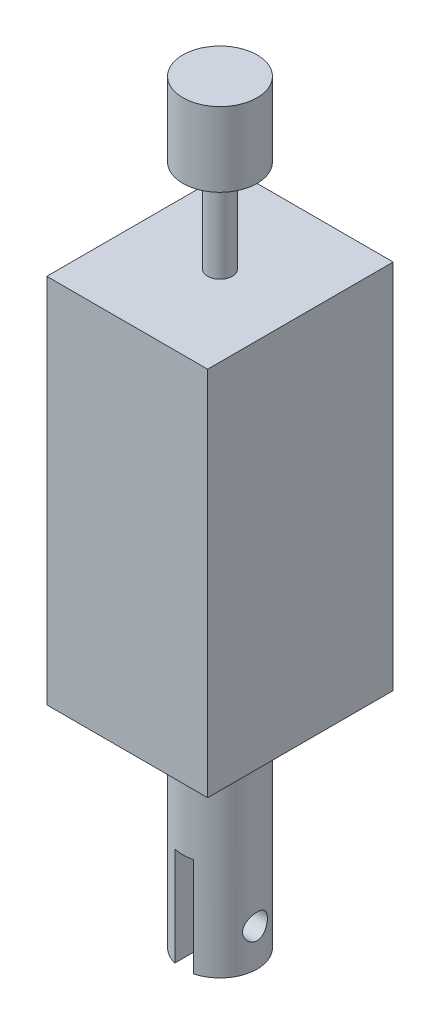
ISO-10303-21;
HEADER;
FILE_DESCRIPTION(('STEP AP214'),'2;1');
FILE_NAME('part.step','',(''),(''),'','','');
FILE_SCHEMA(('AUTOMOTIVE_DESIGN { 1 0 10303 214 1 1 1 1 }'));
ENDSEC;
DATA;
#1=APPLICATION_CONTEXT('core data for automotive mechanical design processes');
#2=APPLICATION_PROTOCOL_DEFINITION('international standard','automotive_design',2000,#1);
#3=PRODUCT_CONTEXT('',#1,'mechanical');
#4=PRODUCT('Part','Part','',(#3));
#5=PRODUCT_RELATED_PRODUCT_CATEGORY('part','',(#4));
#6=PRODUCT_DEFINITION_FORMATION('','',#4);
#7=PRODUCT_DEFINITION_CONTEXT('part definition',#1,'design');
#8=PRODUCT_DEFINITION('design','',#6,#7);
#9=PRODUCT_DEFINITION_SHAPE('','',#8);
#10=(LENGTH_UNIT() NAMED_UNIT(*) SI_UNIT(.MILLI.,.METRE.));
#11=(NAMED_UNIT(*) PLANE_ANGLE_UNIT() SI_UNIT($,.RADIAN.));
#12=(NAMED_UNIT(*) SI_UNIT($,.STERADIAN.) SOLID_ANGLE_UNIT());
#13=UNCERTAINTY_MEASURE_WITH_UNIT(LENGTH_MEASURE(1.E-05),#10,'distance_accuracy_value','');
#14=(GEOMETRIC_REPRESENTATION_CONTEXT(3) GLOBAL_UNCERTAINTY_ASSIGNED_CONTEXT((#13)) GLOBAL_UNIT_ASSIGNED_CONTEXT((#10,
#11,#12)) REPRESENTATION_CONTEXT('',''));
#15=CARTESIAN_POINT('',(0.,0.,0.));
#16=DIRECTION('',(0.,0.,1.));
#17=DIRECTION('',(1.,0.,0.));
#18=AXIS2_PLACEMENT_3D('',#15,#16,#17);
#19=CARTESIAN_POINT('',(0.,-32.5,7.5));
#20=DIRECTION('',(0.,-1.,0.));
#21=DIRECTION('',(0.,0.,-1.));
#22=AXIS2_PLACEMENT_3D('',#19,#20,#21);
#23=PLANE('',#22);
#24=DIRECTION('',(0.,0.,-1.));
#25=VECTOR('',#24,1.);
#26=CARTESIAN_POINT('',(0.75,-32.5,15.));
#27=LINE('',#26,#25);
#28=CARTESIAN_POINT('',(0.75,-32.5,10.4047375096556));
#29=VERTEX_POINT('',#28);
#30=CARTESIAN_POINT('',(0.75,-32.5,4.59526249034444));
#31=VERTEX_POINT('',#30);
#32=EDGE_CURVE('E240',#29,#31,#27,.T.);
#33=ORIENTED_EDGE('',*,*,#32,.T.);
#34=CARTESIAN_POINT('',(0.,-32.5,7.5));
#35=DIRECTION('',(0.,-1.,0.));
#36=DIRECTION('',(0.,0.,-1.));
#37=AXIS2_PLACEMENT_3D('',#34,#35,#36);
#38=CIRCLE('',#37,3.);
#39=EDGE_CURVE('E136',#31,#29,#38,.T.);
#40=ORIENTED_EDGE('',*,*,#39,.T.);
#41=EDGE_LOOP('',(#33,#40));
#42=FACE_BOUND('',#41,.T.);
#43=ADVANCED_FACE('F39',(#42),#23,.T.);
#44=CARTESIAN_POINT('',(-6.5,-29.5,7.5));
#45=DIRECTION('',(1.,0.,0.));
#46=DIRECTION('',(0.,0.,-1.));
#47=AXIS2_PLACEMENT_3D('',#44,#45,#46);
#48=CYLINDRICAL_SURFACE('',#47,1.);
#49=CARTESIAN_POINT('',(0.750000000000001,-29.5,7.5));
#50=DIRECTION('',(1.,0.,0.));
#51=DIRECTION('',(0.,0.,-1.));
#52=AXIS2_PLACEMENT_3D('',#49,#50,#51);
#53=CIRCLE('',#52,1.);
#54=CARTESIAN_POINT('',(0.750000000000001,-29.5,6.5));
#55=VERTEX_POINT('',#54);
#56=EDGE_CURVE('E250',#55,#55,#53,.F.);
#57=ORIENTED_EDGE('',*,*,#56,.T.);
#58=EDGE_LOOP('',(#57));
#59=FACE_BOUND('',#58,.T.);
#60=CARTESIAN_POINT('',(2.82842712474619,-29.5,6.5));
#61=CARTESIAN_POINT('',(2.82842694532735,-29.5544681748107,6.4999997420522));
#62=CARTESIAN_POINT('',(2.83001769372806,-29.6089347997715,6.50446521630186));
#63=CARTESIAN_POINT('',(2.8361757417458,-29.7162544209506,6.52214886829744));
#64=CARTESIAN_POINT('',(2.8407435316722,-29.7691071498639,6.53536848782933));
#65=CARTESIAN_POINT('',(2.85228203663888,-29.8716268930128,6.57004451431974));
#66=CARTESIAN_POINT('',(2.8592480396464,-29.9212999294469,6.591484778598));
#67=CARTESIAN_POINT('',(2.87479122017008,-30.0163600485438,6.64193837155737));
#68=CARTESIAN_POINT('',(2.88336875305432,-30.0617461825525,6.67095337113948));
#69=CARTESIAN_POINT('',(2.90154489405589,-30.1487199623395,6.73694885355748));
#70=CARTESIAN_POINT('',(2.91116894844139,-30.190115428672,6.77417565862218));
#71=CARTESIAN_POINT('',(2.93013864801509,-30.2662068012243,6.85501233278551));
#72=CARTESIAN_POINT('',(2.93948424829099,-30.3009016315823,6.8986232249476));
#73=CARTESIAN_POINT('',(2.95713866921658,-30.3634788973297,6.99239549203502));
#74=CARTESIAN_POINT('',(2.96541407701568,-30.391159970618,7.04269808877548));
#75=CARTESIAN_POINT('',(2.97969586771021,-30.4375915851275,7.14756877701252));
#76=CARTESIAN_POINT('',(2.98570286203012,-30.4563445331769,7.20213571431279));
#77=CARTESIAN_POINT('',(2.99459075431897,-30.4837358546324,7.31197118256651));
#78=CARTESIAN_POINT('',(2.99757314777558,-30.492703446257,7.36714924514704));
#79=CARTESIAN_POINT('',(3.00043608218249,-30.5013162933607,7.47830212517591));
#80=CARTESIAN_POINT('',(3.00031742262891,-30.5009639516524,7.53427673354389));
#81=CARTESIAN_POINT('',(2.99706039618736,-30.491155745434,7.64310351519382));
#82=CARTESIAN_POINT('',(2.99404064755135,-30.4820574715255,7.69599204859167));
#83=CARTESIAN_POINT('',(2.98546967339714,-30.4556070190195,7.79944343882216));
#84=CARTESIAN_POINT('',(2.97991827631115,-30.4382542810202,7.85000613777918));
#85=CARTESIAN_POINT('',(2.96675670293292,-30.3955786826939,7.94815247484201));
#86=CARTESIAN_POINT('',(2.9591204252427,-30.3701540614532,7.995688220969));
#87=CARTESIAN_POINT('',(2.94258393038665,-30.3121402945516,8.08592432552717));
#88=CARTESIAN_POINT('',(2.93368336200518,-30.2795491566734,8.12862333438477));
#89=CARTESIAN_POINT('',(2.9150619185089,-30.2063256065393,8.21010086655191));
#90=CARTESIAN_POINT('',(2.90532215172667,-30.1653868421546,8.24860015706755));
#91=CARTESIAN_POINT('',(2.88647335245111,-30.0775512742773,8.31827725959589));
#92=CARTESIAN_POINT('',(2.8773644173145,-30.0306535542868,8.34945394327301));
#93=CARTESIAN_POINT('',(2.86070525135531,-29.9313463743846,8.40398745504273));
#94=CARTESIAN_POINT('',(2.85317909338821,-29.8788678686322,8.42722646365105));
#95=CARTESIAN_POINT('',(2.84081650878299,-29.7704286057337,8.46444319329951));
#96=CARTESIAN_POINT('',(2.83597895501223,-29.7144693187782,8.47842479575553));
#97=CARTESIAN_POINT('',(2.8297963630207,-29.6033616445994,8.49616128209047));
#98=CARTESIAN_POINT('',(2.82830360315139,-29.5482905752543,8.50034909550575));
#99=CARTESIAN_POINT('',(2.828566720628,-29.438223850883,8.4996054389116));
#100=CARTESIAN_POINT('',(2.83032200792768,-29.3832281839752,8.49467562522726));
#101=CARTESIAN_POINT('',(2.83673618089379,-29.2768430342888,8.47622565155183));
#102=CARTESIAN_POINT('',(2.84129325440593,-29.2253945698494,8.46300639398055));
#103=CARTESIAN_POINT('',(2.8526855367127,-29.1254563937606,8.4287138625606));
#104=CARTESIAN_POINT('',(2.85952114934907,-29.0769672084092,8.40763919636346));
#105=CARTESIAN_POINT('',(2.87496877595718,-28.9826195791531,8.3574743407389));
#106=CARTESIAN_POINT('',(2.8836302566561,-28.9368933573582,8.32815111835849));
#107=CARTESIAN_POINT('',(2.90165768730984,-28.8508539476163,8.26258563055756));
#108=CARTESIAN_POINT('',(2.911023844438,-28.8105423613388,8.22634132549878));
#109=CARTESIAN_POINT('',(2.92995038637844,-28.7344720159094,8.14589170590032));
#110=CARTESIAN_POINT('',(2.93949843577895,-28.6990256099812,8.10138727054665));
#111=CARTESIAN_POINT('',(2.9572685161311,-28.636083857652,8.00682729140026));
#112=CARTESIAN_POINT('',(2.96549059417695,-28.6085882288376,7.95677194486455));
#113=CARTESIAN_POINT('',(2.97964405810603,-28.5625798951383,7.85277986243229));
#114=CARTESIAN_POINT('',(2.98559030004531,-28.5440087228519,7.7988711233212));
#115=CARTESIAN_POINT('',(2.99458610837774,-28.5162722579399,7.68845846584602));
#116=CARTESIAN_POINT('',(2.99763672034018,-28.5071035701195,7.63195549195389));
#117=CARTESIAN_POINT('',(3.00041863236257,-28.4987379223944,7.52081533586004));
#118=CARTESIAN_POINT('',(3.00029920089441,-28.4990925460676,7.46621527607998));
#119=CARTESIAN_POINT('',(2.99712196519396,-28.5086573081464,7.35788885499983));
#120=CARTESIAN_POINT('',(2.99406439933567,-28.5178667281528,7.30416242318094));
#121=CARTESIAN_POINT('',(2.98540914954421,-28.544582234576,7.19995788056794));
#122=CARTESIAN_POINT('',(2.9798525836118,-28.561954215353,7.1494417290872));
#123=CARTESIAN_POINT('',(2.96677160704464,-28.6043775310971,7.05202164906021));
#124=CARTESIAN_POINT('',(2.95924684047901,-28.6294302551969,7.00511837585759));
#125=CARTESIAN_POINT('',(2.94265868828001,-28.6875695121021,6.91436598369119));
#126=CARTESIAN_POINT('',(2.93354872492381,-28.7209186853819,6.8706937484423));
#127=CARTESIAN_POINT('',(2.91492988791425,-28.7942573911559,6.78941897372766));
#128=CARTESIAN_POINT('',(2.90542088771397,-28.8342490422617,6.75181837837574));
#129=CARTESIAN_POINT('',(2.88663279827365,-28.921609355588,6.68225819116654));
#130=CARTESIAN_POINT('',(2.87737727995345,-28.9692055109808,6.65057703400078));
#131=CARTESIAN_POINT('',(2.86060193316303,-29.0693344268987,6.5956856567002));
#132=CARTESIAN_POINT('',(2.8530816513617,-29.1218658930142,6.57247322318544));
#133=CARTESIAN_POINT('',(2.84101334230535,-29.2279618240238,6.53615617179337));
#134=CARTESIAN_POINT('',(2.83634632944799,-29.2813722635657,6.52264209083673));
#135=CARTESIAN_POINT('',(2.83005383613939,-29.3898560505155,6.50456567983831));
#136=CARTESIAN_POINT('',(2.82842730615135,-29.4449288174357,6.5000002608035));
#137=CARTESIAN_POINT('',(2.82842712474619,-29.5,6.5));
#138=B_SPLINE_CURVE_WITH_KNOTS('',3,(#60,#61,#62,#63,#64,#65,#66,#67,#68,#69,#70,#71,#72,#73,
#74,#75,#76,#77,#78,#79,#80,#81,#82,#83,#84,#85,#86,#87,#88,#89,#90,#91,#92,#93,#94,#95,#96,#97,
#98,#99,#100,#101,#102,#103,#104,#105,#106,#107,#108,#109,#110,#111,#112,#113,#114,#115,#116,
#117,#118,#119,#120,#121,#122,#123,#124,#125,#126,#127,#128,#129,#130,#131,#132,#133,#134,#135,
#136,#137),.UNSPECIFIED.,.T.,.F.,(4,2,2,2,2,2,2,2,2,2,2,2,2,2,2,2,2,2,2,2,2,2,2,2,2,2,2,2,2,2,2,
2,2,2,2,2,2,2,4),(0.,0.163200584775416,0.326428054968882,0.489336627454547,0.652281166139164,
0.821013374229402,0.989772651673597,1.16293506139029,1.33605076382161,1.50314318760306,
1.67019253297699,1.83069004820941,1.99119844184608,2.15381654855707,2.31647991869394,
2.48680174359289,2.65714979607478,2.82992639837376,3.00263051349689,3.16754291357513,
3.33242535830307,3.49164395761849,3.65089079140019,3.81518857728788,3.979534856552,
4.15178808164166,4.32403518750605,4.49513791183924,4.66617882997229,4.82918084670708,
4.99216964002854,5.15256956033503,5.31299850756315,5.47935519513706,5.64576504425705,
5.81868902729218,5.99156778259939,6.15663212153686,6.32163947179229),.UNSPECIFIED.);
#139=CARTESIAN_POINT('',(2.82842712474619,-29.5,6.5));
#140=VERTEX_POINT('',#139);
#141=EDGE_CURVE('E153',#140,#140,#138,.T.);
#142=ORIENTED_EDGE('',*,*,#141,.F.);
#143=EDGE_LOOP('',(#142));
#144=FACE_BOUND('',#143,.T.);
#145=ADVANCED_FACE('F224',(#59,#144),#48,.F.);
#146=CARTESIAN_POINT('',(6.5,-15.,15.));
#147=DIRECTION('',(-1.,0.,0.));
#148=DIRECTION('',(0.,0.,1.));
#149=AXIS2_PLACEMENT_3D('',#146,#147,#148);
#150=PLANE('',#149);
#151=DIRECTION('',(0.,1.,0.));
#152=VECTOR('',#151,1.);
#153=CARTESIAN_POINT('',(6.5,-15.,0.));
#154=LINE('',#153,#152);
#155=CARTESIAN_POINT('',(6.5,-15.,0.));
#156=VERTEX_POINT('',#155);
#157=CARTESIAN_POINT('',(6.5,15.,0.));
#158=VERTEX_POINT('',#157);
#159=EDGE_CURVE('E166',#156,#158,#154,.T.);
#160=ORIENTED_EDGE('',*,*,#159,.T.);
#161=DIRECTION('',(0.,0.,-1.));
#162=VECTOR('',#161,1.);
#163=CARTESIAN_POINT('',(6.5,15.,15.));
#164=LINE('',#163,#162);
#165=CARTESIAN_POINT('',(6.5,15.,15.));
#166=VERTEX_POINT('',#165);
#167=EDGE_CURVE('E198',#166,#158,#164,.T.);
#168=ORIENTED_EDGE('',*,*,#167,.F.);
#169=DIRECTION('',(0.,1.,0.));
#170=VECTOR('',#169,1.);
#171=CARTESIAN_POINT('',(6.5,-15.,15.));
#172=LINE('',#171,#170);
#173=CARTESIAN_POINT('',(6.5,-15.,15.));
#174=VERTEX_POINT('',#173);
#175=EDGE_CURVE('E167',#174,#166,#172,.T.);
#176=ORIENTED_EDGE('',*,*,#175,.F.);
#177=DIRECTION('',(0.,0.,-1.));
#178=VECTOR('',#177,1.);
#179=CARTESIAN_POINT('',(6.5,-15.,15.));
#180=LINE('',#179,#178);
#181=EDGE_CURVE('E177',#174,#156,#180,.T.);
#182=ORIENTED_EDGE('',*,*,#181,.T.);
#183=EDGE_LOOP('',(#160,#168,#176,#182));
#184=FACE_BOUND('',#183,.T.);
#185=ADVANCED_FACE('F41',(#184),#150,.F.);
#186=CARTESIAN_POINT('',(-6.5,15.,15.));
#187=DIRECTION('',(0.,-1.,0.));
#188=DIRECTION('',(0.,0.,-1.));
#189=AXIS2_PLACEMENT_3D('',#186,#187,#188);
#190=PLANE('',#189);
#191=CARTESIAN_POINT('',(0.,15.,7.5));
#192=DIRECTION('',(0.,-1.,0.));
#193=DIRECTION('',(0.,0.,-1.));
#194=AXIS2_PLACEMENT_3D('',#191,#192,#193);
#195=CIRCLE('',#194,1.);
#196=CARTESIAN_POINT('',(0.,15.,6.5));
#197=VERTEX_POINT('',#196);
#198=EDGE_CURVE('E154',#197,#197,#195,.F.);
#199=ORIENTED_EDGE('',*,*,#198,.F.);
#200=EDGE_LOOP('',(#199));
#201=FACE_BOUND('',#200,.T.);
#202=DIRECTION('',(-1.,0.,0.));
#203=VECTOR('',#202,1.);
#204=CARTESIAN_POINT('',(-6.5,15.,0.));
#205=LINE('',#204,#203);
#206=CARTESIAN_POINT('',(-6.5,15.,0.));
#207=VERTEX_POINT('',#206);
#208=EDGE_CURVE('E181',#158,#207,#205,.T.);
#209=ORIENTED_EDGE('',*,*,#208,.T.);
#210=DIRECTION('',(0.,0.,-1.));
#211=VECTOR('',#210,1.);
#212=CARTESIAN_POINT('',(-6.5,15.,15.));
#213=LINE('',#212,#211);
#214=CARTESIAN_POINT('',(-6.5,15.,15.));
#215=VERTEX_POINT('',#214);
#216=EDGE_CURVE('E194',#215,#207,#213,.T.);
#217=ORIENTED_EDGE('',*,*,#216,.F.);
#218=DIRECTION('',(-1.,0.,0.));
#219=VECTOR('',#218,1.);
#220=CARTESIAN_POINT('',(-6.5,15.,15.));
#221=LINE('',#220,#219);
#222=EDGE_CURVE('E93',#166,#215,#221,.T.);
#223=ORIENTED_EDGE('',*,*,#222,.F.);
#224=ORIENTED_EDGE('',*,*,#167,.T.);
#225=EDGE_LOOP('',(#209,#217,#223,#224));
#226=FACE_BOUND('',#225,.T.);
#227=ADVANCED_FACE('F381',(#201,#226),#190,.F.);
#228=CARTESIAN_POINT('',(-6.5,-15.,15.));
#229=DIRECTION('',(1.,0.,0.));
#230=DIRECTION('',(0.,0.,-1.));
#231=AXIS2_PLACEMENT_3D('',#228,#229,#230);
#232=PLANE('',#231);
#233=DIRECTION('',(0.,-1.,0.));
#234=VECTOR('',#233,1.);
#235=CARTESIAN_POINT('',(-6.5,-15.,0.));
#236=LINE('',#235,#234);
#237=CARTESIAN_POINT('',(-6.5,-15.,0.));
#238=VERTEX_POINT('',#237);
#239=EDGE_CURVE('E184',#207,#238,#236,.T.);
#240=ORIENTED_EDGE('',*,*,#239,.T.);
#241=DIRECTION('',(0.,0.,-1.));
#242=VECTOR('',#241,1.);
#243=CARTESIAN_POINT('',(-6.5,-15.,15.));
#244=LINE('',#243,#242);
#245=CARTESIAN_POINT('',(-6.5,-15.,15.));
#246=VERTEX_POINT('',#245);
#247=EDGE_CURVE('E191',#246,#238,#244,.T.);
#248=ORIENTED_EDGE('',*,*,#247,.F.);
#249=DIRECTION('',(0.,-1.,0.));
#250=VECTOR('',#249,1.);
#251=CARTESIAN_POINT('',(-6.5,-15.,15.));
#252=LINE('',#251,#250);
#253=EDGE_CURVE('E172',#215,#246,#252,.T.);
#254=ORIENTED_EDGE('',*,*,#253,.F.);
#255=ORIENTED_EDGE('',*,*,#216,.T.);
#256=EDGE_LOOP('',(#240,#248,#254,#255));
#257=FACE_BOUND('',#256,.T.);
#258=ADVANCED_FACE('F332',(#257),#232,.F.);
#259=CARTESIAN_POINT('',(-6.5,-15.,15.));
#260=DIRECTION('',(0.,1.,0.));
#261=DIRECTION('',(0.,0.,1.));
#262=AXIS2_PLACEMENT_3D('',#259,#260,#261);
#263=PLANE('',#262);
#264=CARTESIAN_POINT('',(0.,-15.,7.5));
#265=DIRECTION('',(0.,-1.,0.));
#266=DIRECTION('',(0.,0.,-1.));
#267=AXIS2_PLACEMENT_3D('',#264,#265,#266);
#268=CIRCLE('',#267,3.);
#269=CARTESIAN_POINT('',(0.,-15.,4.5));
#270=VERTEX_POINT('',#269);
#271=EDGE_CURVE('E149',#270,#270,#268,.T.);
#272=ORIENTED_EDGE('',*,*,#271,.F.);
#273=EDGE_LOOP('',(#272));
#274=FACE_BOUND('',#273,.T.);
#275=DIRECTION('',(1.,0.,0.));
#276=VECTOR('',#275,1.);
#277=CARTESIAN_POINT('',(-6.5,-15.,0.));
#278=LINE('',#277,#276);
#279=EDGE_CURVE('E85',#238,#156,#278,.T.);
#280=ORIENTED_EDGE('',*,*,#279,.T.);
#281=ORIENTED_EDGE('',*,*,#181,.F.);
#282=DIRECTION('',(1.,0.,0.));
#283=VECTOR('',#282,1.);
#284=CARTESIAN_POINT('',(-6.5,-15.,15.));
#285=LINE('',#284,#283);
#286=EDGE_CURVE('E64',#246,#174,#285,.T.);
#287=ORIENTED_EDGE('',*,*,#286,.F.);
#288=ORIENTED_EDGE('',*,*,#247,.T.);
#289=EDGE_LOOP('',(#280,#281,#287,#288));
#290=FACE_BOUND('',#289,.T.);
#291=ADVANCED_FACE('F326',(#274,#290),#263,.F.);
#292=CARTESIAN_POINT('',(0.,0.,15.));
#293=DIRECTION('',(0.,0.,-1.));
#294=DIRECTION('',(-1.,0.,0.));
#295=AXIS2_PLACEMENT_3D('',#292,#293,#294);
#296=PLANE('',#295);
#297=ORIENTED_EDGE('',*,*,#175,.T.);
#298=ORIENTED_EDGE('',*,*,#222,.T.);
#299=ORIENTED_EDGE('',*,*,#253,.T.);
#300=ORIENTED_EDGE('',*,*,#286,.T.);
#301=EDGE_LOOP('',(#297,#298,#299,#300));
#302=FACE_BOUND('',#301,.T.);
#303=ADVANCED_FACE('F331',(#302),#296,.F.);
#304=CARTESIAN_POINT('',(0.,0.,0.));
#305=DIRECTION('',(0.,0.,-1.));
#306=DIRECTION('',(-1.,0.,0.));
#307=AXIS2_PLACEMENT_3D('',#304,#305,#306);
#308=PLANE('',#307);
#309=ORIENTED_EDGE('',*,*,#159,.F.);
#310=ORIENTED_EDGE('',*,*,#279,.F.);
#311=ORIENTED_EDGE('',*,*,#239,.F.);
#312=ORIENTED_EDGE('',*,*,#208,.F.);
#313=EDGE_LOOP('',(#309,#310,#311,#312));
#314=FACE_BOUND('',#313,.T.);
#315=ADVANCED_FACE('F373',(#314),#308,.T.);
#316=CARTESIAN_POINT('',(0.,22.5,7.5));
#317=DIRECTION('',(0.,-1.,0.));
#318=DIRECTION('',(0.,0.,-1.));
#319=AXIS2_PLACEMENT_3D('',#316,#317,#318);
#320=CYLINDRICAL_SURFACE('',#319,1.);
#321=CARTESIAN_POINT('',(0.,22.5,7.5));
#322=DIRECTION('',(0.,1.,0.));
#323=DIRECTION('',(0.,0.,1.));
#324=AXIS2_PLACEMENT_3D('',#321,#322,#323);
#325=CIRCLE('',#324,1.);
#326=CARTESIAN_POINT('',(0.,22.5,8.5));
#327=VERTEX_POINT('',#326);
#328=EDGE_CURVE('E159',#327,#327,#325,.T.);
#329=ORIENTED_EDGE('',*,*,#328,.F.);
#330=EDGE_LOOP('',(#329));
#331=FACE_BOUND('',#330,.T.);
#332=ORIENTED_EDGE('',*,*,#198,.T.);
#333=EDGE_LOOP('',(#332));
#334=FACE_BOUND('',#333,.T.);
#335=ADVANCED_FACE('F363',(#331,#334),#320,.T.);
#336=CARTESIAN_POINT('',(0.,28.5,7.5));
#337=DIRECTION('',(0.,-1.,0.));
#338=DIRECTION('',(0.,0.,-1.));
#339=AXIS2_PLACEMENT_3D('',#336,#337,#338);
#340=CYLINDRICAL_SURFACE('',#339,3.);
#341=CARTESIAN_POINT('',(0.,28.5,7.5));
#342=DIRECTION('',(0.,1.,0.));
#343=DIRECTION('',(0.,0.,1.));
#344=AXIS2_PLACEMENT_3D('',#341,#342,#343);
#345=CIRCLE('',#344,3.);
#346=CARTESIAN_POINT('',(0.,28.5,10.5));
#347=VERTEX_POINT('',#346);
#348=EDGE_CURVE('E155',#347,#347,#345,.T.);
#349=ORIENTED_EDGE('',*,*,#348,.F.);
#350=EDGE_LOOP('',(#349));
#351=FACE_BOUND('',#350,.T.);
#352=CARTESIAN_POINT('',(0.,22.5,7.5));
#353=DIRECTION('',(0.,1.,0.));
#354=DIRECTION('',(0.,0.,1.));
#355=AXIS2_PLACEMENT_3D('',#352,#353,#354);
#356=CIRCLE('',#355,3.);
#357=CARTESIAN_POINT('',(0.,22.5,10.5));
#358=VERTEX_POINT('',#357);
#359=EDGE_CURVE('E142',#358,#358,#356,.T.);
#360=ORIENTED_EDGE('',*,*,#359,.T.);
#361=EDGE_LOOP('',(#360));
#362=FACE_BOUND('',#361,.T.);
#363=ADVANCED_FACE('F354',(#351,#362),#340,.T.);
#364=CARTESIAN_POINT('',(0.,28.5,7.5));
#365=DIRECTION('',(0.,1.,0.));
#366=DIRECTION('',(0.,0.,1.));
#367=AXIS2_PLACEMENT_3D('',#364,#365,#366);
#368=PLANE('',#367);
#369=ORIENTED_EDGE('',*,*,#348,.T.);
#370=EDGE_LOOP('',(#369));
#371=FACE_BOUND('',#370,.T.);
#372=ADVANCED_FACE('F344',(#371),#368,.T.);
#373=CARTESIAN_POINT('',(0.,22.5,7.5));
#374=DIRECTION('',(0.,1.,0.));
#375=DIRECTION('',(0.,0.,1.));
#376=AXIS2_PLACEMENT_3D('',#373,#374,#375);
#377=PLANE('',#376);
#378=ORIENTED_EDGE('',*,*,#328,.T.);
#379=EDGE_LOOP('',(#378));
#380=FACE_BOUND('',#379,.T.);
#381=ORIENTED_EDGE('',*,*,#359,.F.);
#382=EDGE_LOOP('',(#381));
#383=FACE_BOUND('',#382,.T.);
#384=ADVANCED_FACE('F231',(#380,#383),#377,.F.);
#385=CARTESIAN_POINT('',(0.,-32.5,7.5));
#386=DIRECTION('',(0.,1.,0.));
#387=DIRECTION('',(0.,0.,1.));
#388=AXIS2_PLACEMENT_3D('',#385,#386,#387);
#389=CYLINDRICAL_SURFACE('',#388,3.);
#390=CARTESIAN_POINT('',(-2.82842712474619,-29.5,6.5));
#391=CARTESIAN_POINT('',(-2.82842694532735,-29.4455318251893,6.4999997420522));
#392=CARTESIAN_POINT('',(-2.83001769372806,-29.3910652002285,6.50446521630186));
#393=CARTESIAN_POINT('',(-2.8361757417458,-29.2837455790494,6.52214886829744));
#394=CARTESIAN_POINT('',(-2.8407435316722,-29.2308928501361,6.53536848782933));
#395=CARTESIAN_POINT('',(-2.85228203663888,-29.1283731069872,6.57004451431974));
#396=CARTESIAN_POINT('',(-2.8592480396464,-29.0787000705531,6.591484778598));
#397=CARTESIAN_POINT('',(-2.87479122017008,-28.9836399514562,6.64193837155737));
#398=CARTESIAN_POINT('',(-2.88336875305432,-28.9382538174475,6.67095337113948));
#399=CARTESIAN_POINT('',(-2.90154489405589,-28.8512800376605,6.73694885355748));
#400=CARTESIAN_POINT('',(-2.91116894844139,-28.809884571328,6.77417565862218));
#401=CARTESIAN_POINT('',(-2.93013864801509,-28.7337931987757,6.85501233278551));
#402=CARTESIAN_POINT('',(-2.93948424829099,-28.6990983684177,6.8986232249476));
#403=CARTESIAN_POINT('',(-2.95713866921658,-28.6365211026703,6.99239549203502));
#404=CARTESIAN_POINT('',(-2.96541407701568,-28.608840029382,7.04269808877548));
#405=CARTESIAN_POINT('',(-2.97969586771021,-28.5624084148725,7.14756877701252));
#406=CARTESIAN_POINT('',(-2.98570286203012,-28.5436554668231,7.20213571431279));
#407=CARTESIAN_POINT('',(-2.99459075431897,-28.5162641453676,7.31197118256651));
#408=CARTESIAN_POINT('',(-2.99757314777558,-28.507296553743,7.36714924514704));
#409=CARTESIAN_POINT('',(-3.00043608218249,-28.4986837066393,7.47830212517591));
#410=CARTESIAN_POINT('',(-3.00031742262891,-28.4990360483476,7.53427673354389));
#411=CARTESIAN_POINT('',(-2.99706039618736,-28.508844254566,7.64310351519382));
#412=CARTESIAN_POINT('',(-2.99404064755135,-28.5179425284745,7.69599204859167));
#413=CARTESIAN_POINT('',(-2.98546967339714,-28.5443929809805,7.79944343882216));
#414=CARTESIAN_POINT('',(-2.97991827631115,-28.5617457189798,7.85000613777918));
#415=CARTESIAN_POINT('',(-2.96675670293292,-28.6044213173061,7.94815247484201));
#416=CARTESIAN_POINT('',(-2.9591204252427,-28.6298459385468,7.995688220969));
#417=CARTESIAN_POINT('',(-2.94258393038665,-28.6878597054484,8.08592432552717));
#418=CARTESIAN_POINT('',(-2.93368336200518,-28.7204508433266,8.12862333438477));
#419=CARTESIAN_POINT('',(-2.9150619185089,-28.7936743934607,8.21010086655191));
#420=CARTESIAN_POINT('',(-2.90532215172667,-28.8346131578454,8.24860015706756));
#421=CARTESIAN_POINT('',(-2.88647335245111,-28.9224487257227,8.31827725959589));
#422=CARTESIAN_POINT('',(-2.8773644173145,-28.9693464457132,8.34945394327301));
#423=CARTESIAN_POINT('',(-2.86070525135531,-29.0686536256154,8.40398745504273));
#424=CARTESIAN_POINT('',(-2.85317909338821,-29.1211321313678,8.42722646365105));
#425=CARTESIAN_POINT('',(-2.84081650878299,-29.2295713942663,8.46444319329951));
#426=CARTESIAN_POINT('',(-2.83597895501223,-29.2855306812218,8.47842479575553));
#427=CARTESIAN_POINT('',(-2.8297963630207,-29.3966383554006,8.49616128209047));
#428=CARTESIAN_POINT('',(-2.82830360315139,-29.4517094247457,8.50034909550575));
#429=CARTESIAN_POINT('',(-2.828566720628,-29.561776149117,8.4996054389116));
#430=CARTESIAN_POINT('',(-2.83032200792768,-29.6167718160248,8.49467562522726));
#431=CARTESIAN_POINT('',(-2.83673618089379,-29.7231569657112,8.47622565155183));
#432=CARTESIAN_POINT('',(-2.84129325440593,-29.7746054301506,8.46300639398055));
#433=CARTESIAN_POINT('',(-2.8526855367127,-29.8745436062394,8.4287138625606));
#434=CARTESIAN_POINT('',(-2.85952114934907,-29.9230327915908,8.40763919636346));
#435=CARTESIAN_POINT('',(-2.87496877595718,-30.0173804208469,8.3574743407389));
#436=CARTESIAN_POINT('',(-2.8836302566561,-30.0631066426418,8.32815111835849));
#437=CARTESIAN_POINT('',(-2.90165768730984,-30.1491460523837,8.26258563055757));
#438=CARTESIAN_POINT('',(-2.911023844438,-30.1894576386612,8.22634132549878));
#439=CARTESIAN_POINT('',(-2.92995038637844,-30.2655279840906,8.14589170590032));
#440=CARTESIAN_POINT('',(-2.93949843577895,-30.3009743900189,8.10138727054665));
#441=CARTESIAN_POINT('',(-2.9572685161311,-30.363916142348,8.00682729140026));
#442=CARTESIAN_POINT('',(-2.96549059417695,-30.3914117711624,7.95677194486455));
#443=CARTESIAN_POINT('',(-2.97964405810603,-30.4374201048617,7.85277986243229));
#444=CARTESIAN_POINT('',(-2.98559030004531,-30.4559912771481,7.7988711233212));
#445=CARTESIAN_POINT('',(-2.99458610837774,-30.4837277420601,7.68845846584601));
#446=CARTESIAN_POINT('',(-2.99763672034018,-30.4928964298805,7.63195549195389));
#447=CARTESIAN_POINT('',(-3.00041863236257,-30.5012620776056,7.52081533586004));
#448=CARTESIAN_POINT('',(-3.00029920089441,-30.5009074539324,7.46621527607998));
#449=CARTESIAN_POINT('',(-2.99712196519396,-30.4913426918536,7.35788885499983));
#450=CARTESIAN_POINT('',(-2.99406439933567,-30.4821332718472,7.30416242318094));
#451=CARTESIAN_POINT('',(-2.98540914954421,-30.455417765424,7.19995788056794));
#452=CARTESIAN_POINT('',(-2.9798525836118,-30.438045784647,7.1494417290872));
#453=CARTESIAN_POINT('',(-2.96677160704464,-30.3956224689029,7.05202164906021));
#454=CARTESIAN_POINT('',(-2.95924684047901,-30.3705697448031,7.00511837585759));
#455=CARTESIAN_POINT('',(-2.94265868828001,-30.3124304878979,6.91436598369119));
#456=CARTESIAN_POINT('',(-2.93354872492381,-30.2790813146181,6.8706937484423));
#457=CARTESIAN_POINT('',(-2.91492988791425,-30.2057426088441,6.78941897372766));
#458=CARTESIAN_POINT('',(-2.90542088771397,-30.1657509577383,6.75181837837574));
#459=CARTESIAN_POINT('',(-2.88663279827365,-30.078390644412,6.68225819116654));
#460=CARTESIAN_POINT('',(-2.87737727995345,-30.0307944890192,6.65057703400078));
#461=CARTESIAN_POINT('',(-2.86060193316303,-29.9306655731014,6.5956856567002));
#462=CARTESIAN_POINT('',(-2.8530816513617,-29.8781341069858,6.57247322318544));
#463=CARTESIAN_POINT('',(-2.84101334230535,-29.7720381759762,6.53615617179337));
#464=CARTESIAN_POINT('',(-2.83634632944799,-29.7186277364343,6.52264209083673));
#465=CARTESIAN_POINT('',(-2.8300538361394,-29.6101439494845,6.50456567983831));
#466=CARTESIAN_POINT('',(-2.82842730615135,-29.5550711825643,6.5000002608035));
#467=CARTESIAN_POINT('',(-2.82842712474619,-29.5,6.5));
#468=B_SPLINE_CURVE_WITH_KNOTS('',3,(#390,#391,#392,#393,#394,#395,#396,#397,#398,#399,#400,
#401,#402,#403,#404,#405,#406,#407,#408,#409,#410,#411,#412,#413,#414,#415,#416,#417,#418,#419,
#420,#421,#422,#423,#424,#425,#426,#427,#428,#429,#430,#431,#432,#433,#434,#435,#436,#437,#438,
#439,#440,#441,#442,#443,#444,#445,#446,#447,#448,#449,#450,#451,#452,#453,#454,#455,#456,#457,
#458,#459,#460,#461,#462,#463,#464,#465,#466,#467),.UNSPECIFIED.,.T.,.F.,(4,2,2,2,2,2,2,2,2,2,2,
2,2,2,2,2,2,2,2,2,2,2,2,2,2,2,2,2,2,2,2,2,2,2,2,2,2,2,4),(0.,0.163200584775419,
0.326428054968882,0.489336627454547,0.652281166139164,0.821013374229401,0.989772651673597,
1.16293506139029,1.33605076382161,1.50314318760306,1.67019253297699,1.83069004820941,
1.99119844184608,2.15381654855707,2.31647991869394,2.48680174359289,2.65714979607478,
2.82992639837376,3.00263051349689,3.16754291357513,3.33242535830307,3.49164395761849,
3.65089079140019,3.81518857728788,3.97953485655201,4.15178808164166,4.32403518750605,
4.49513791183925,4.6661788299723,4.82918084670708,4.99216964002854,5.15256956033503,
5.31299850756316,5.47935519513707,5.64576504425705,5.81868902729218,5.99156778259939,
6.15663212153686,6.32163947179229),.UNSPECIFIED.);
#469=CARTESIAN_POINT('',(-2.82842712474619,-29.5,6.5));
#470=VERTEX_POINT('',#469);
#471=EDGE_CURVE('E137',#470,#470,#468,.T.);
#472=ORIENTED_EDGE('',*,*,#471,.T.);
#473=EDGE_LOOP('',(#472));
#474=FACE_BOUND('',#473,.T.);
#475=ORIENTED_EDGE('',*,*,#141,.T.);
#476=EDGE_LOOP('',(#475));
#477=FACE_BOUND('',#476,.T.);
#478=ORIENTED_EDGE('',*,*,#39,.F.);
#479=DIRECTION('',(0.,1.,0.));
#480=VECTOR('',#479,1.);
#481=CARTESIAN_POINT('',(0.75,-32.5,4.59526249034444));
#482=LINE('',#481,#480);
#483=CARTESIAN_POINT('',(0.75,-24.5,4.59526249034444));
#484=VERTEX_POINT('',#483);
#485=EDGE_CURVE('E144',#31,#484,#482,.T.);
#486=ORIENTED_EDGE('',*,*,#485,.T.);
#487=CARTESIAN_POINT('',(0.,-24.5,7.5));
#488=DIRECTION('',(0.,1.,0.));
#489=DIRECTION('',(0.,0.,1.));
#490=AXIS2_PLACEMENT_3D('',#487,#488,#489);
#491=CIRCLE('',#490,3.);
#492=CARTESIAN_POINT('',(-0.75,-24.5,4.59526249034444));
#493=VERTEX_POINT('',#492);
#494=EDGE_CURVE('E43',#484,#493,#491,.T.);
#495=ORIENTED_EDGE('',*,*,#494,.T.);
#496=DIRECTION('',(0.,1.,0.));
#497=VECTOR('',#496,1.);
#498=CARTESIAN_POINT('',(-0.75,-32.5,4.59526249034444));
#499=LINE('',#498,#497);
#500=CARTESIAN_POINT('',(-0.75,-32.5,4.59526249034444));
#501=VERTEX_POINT('',#500);
#502=EDGE_CURVE('E116',#493,#501,#499,.F.);
#503=ORIENTED_EDGE('',*,*,#502,.T.);
#504=CARTESIAN_POINT('',(-0.75,-32.5,10.4047375096556));
#505=VERTEX_POINT('',#504);
#506=EDGE_CURVE('E129',#505,#501,#38,.T.);
#507=ORIENTED_EDGE('',*,*,#506,.F.);
#508=DIRECTION('',(0.,1.,0.));
#509=VECTOR('',#508,1.);
#510=CARTESIAN_POINT('',(-0.75,-32.5,10.4047375096556));
#511=LINE('',#510,#509);
#512=CARTESIAN_POINT('',(-0.75,-24.5,10.4047375096556));
#513=VERTEX_POINT('',#512);
#514=EDGE_CURVE('E55',#505,#513,#511,.T.);
#515=ORIENTED_EDGE('',*,*,#514,.T.);
#516=CARTESIAN_POINT('',(0.75,-24.5,10.4047375096556));
#517=VERTEX_POINT('',#516);
#518=EDGE_CURVE('E11',#513,#517,#491,.T.);
#519=ORIENTED_EDGE('',*,*,#518,.T.);
#520=DIRECTION('',(0.,1.,0.));
#521=VECTOR('',#520,1.);
#522=CARTESIAN_POINT('',(0.75,-32.5,10.4047375096556));
#523=LINE('',#522,#521);
#524=EDGE_CURVE('E246',#517,#29,#523,.F.);
#525=ORIENTED_EDGE('',*,*,#524,.T.);
#526=EDGE_LOOP('',(#478,#486,#495,#503,#507,#515,#519,#525));
#527=FACE_BOUND('',#526,.T.);
#528=ORIENTED_EDGE('',*,*,#271,.T.);
#529=EDGE_LOOP('',(#528));
#530=FACE_BOUND('',#529,.T.);
#531=ADVANCED_FACE('F127',(#474,#477,#527,#530),#389,.T.);
#532=DIRECTION('',(0.,0.,-1.));
#533=VECTOR('',#532,1.);
#534=CARTESIAN_POINT('',(-0.75,-32.5,15.));
#535=LINE('',#534,#533);
#536=EDGE_CURVE('E113',#505,#501,#535,.T.);
#537=ORIENTED_EDGE('',*,*,#536,.F.);
#538=ORIENTED_EDGE('',*,*,#506,.T.);
#539=EDGE_LOOP('',(#537,#538));
#540=FACE_BOUND('',#539,.T.);
#541=ADVANCED_FACE('F134',(#540),#23,.T.);
#542=CARTESIAN_POINT('',(-0.750000000000001,-29.5,7.5));
#543=DIRECTION('',(-1.,0.,0.));
#544=DIRECTION('',(0.,0.,1.));
#545=AXIS2_PLACEMENT_3D('',#542,#543,#544);
#546=CIRCLE('',#545,1.);
#547=CARTESIAN_POINT('',(-0.750000000000001,-29.5,8.5));
#548=VERTEX_POINT('',#547);
#549=EDGE_CURVE('E132',#548,#548,#546,.F.);
#550=ORIENTED_EDGE('',*,*,#549,.T.);
#551=EDGE_LOOP('',(#550));
#552=FACE_BOUND('',#551,.T.);
#553=ORIENTED_EDGE('',*,*,#471,.F.);
#554=EDGE_LOOP('',(#553));
#555=FACE_BOUND('',#554,.T.);
#556=ADVANCED_FACE('F218',(#552,#555),#48,.F.);
#557=CARTESIAN_POINT('',(-0.75,-24.5,15.));
#558=DIRECTION('',(0.,1.,0.));
#559=DIRECTION('',(0.,0.,1.));
#560=AXIS2_PLACEMENT_3D('',#557,#558,#559);
#561=PLANE('',#560);
#562=DIRECTION('',(0.,0.,-1.));
#563=VECTOR('',#562,1.);
#564=CARTESIAN_POINT('',(0.75,-24.5,15.));
#565=LINE('',#564,#563);
#566=EDGE_CURVE('E244',#517,#484,#565,.T.);
#567=ORIENTED_EDGE('',*,*,#566,.F.);
#568=ORIENTED_EDGE('',*,*,#518,.F.);
#569=DIRECTION('',(0.,0.,-1.));
#570=VECTOR('',#569,1.);
#571=CARTESIAN_POINT('',(-0.75,-24.5,15.));
#572=LINE('',#571,#570);
#573=EDGE_CURVE('E122',#513,#493,#572,.T.);
#574=ORIENTED_EDGE('',*,*,#573,.T.);
#575=ORIENTED_EDGE('',*,*,#494,.F.);
#576=EDGE_LOOP('',(#567,#568,#574,#575));
#577=FACE_BOUND('',#576,.T.);
#578=ADVANCED_FACE('F222',(#577),#561,.F.);
#579=CARTESIAN_POINT('',(0.75,-24.5,15.));
#580=DIRECTION('',(1.,0.,0.));
#581=DIRECTION('',(0.,0.,-1.));
#582=AXIS2_PLACEMENT_3D('',#579,#580,#581);
#583=PLANE('',#582);
#584=ORIENTED_EDGE('',*,*,#56,.F.);
#585=EDGE_LOOP('',(#584));
#586=FACE_BOUND('',#585,.T.);
#587=ORIENTED_EDGE('',*,*,#32,.F.);
#588=ORIENTED_EDGE('',*,*,#524,.F.);
#589=ORIENTED_EDGE('',*,*,#566,.T.);
#590=ORIENTED_EDGE('',*,*,#485,.F.);
#591=EDGE_LOOP('',(#587,#588,#589,#590));
#592=FACE_BOUND('',#591,.T.);
#593=ADVANCED_FACE('F260',(#586,#592),#583,.F.);
#594=CARTESIAN_POINT('',(-0.75,-32.5,15.));
#595=DIRECTION('',(-1.,0.,0.));
#596=DIRECTION('',(0.,0.,1.));
#597=AXIS2_PLACEMENT_3D('',#594,#595,#596);
#598=PLANE('',#597);
#599=ORIENTED_EDGE('',*,*,#549,.F.);
#600=EDGE_LOOP('',(#599));
#601=FACE_BOUND('',#600,.T.);
#602=ORIENTED_EDGE('',*,*,#536,.T.);
#603=ORIENTED_EDGE('',*,*,#502,.F.);
#604=ORIENTED_EDGE('',*,*,#573,.F.);
#605=ORIENTED_EDGE('',*,*,#514,.F.);
#606=EDGE_LOOP('',(#602,#603,#604,#605));
#607=FACE_BOUND('',#606,.T.);
#608=ADVANCED_FACE('F115',(#601,#607),#598,.F.);
#609=CLOSED_SHELL('',(#43,#145,#185,#227,#258,#291,#303,#315,#335,#363,#372,#384,#531,#541,#556,
#578,#593,#608));
#610=MANIFOLD_SOLID_BREP('B2',#609);
#611=ADVANCED_BREP_SHAPE_REPRESENTATION('',(#18,#610),#14);
#612=SHAPE_DEFINITION_REPRESENTATION(#9,#611);
ENDSEC;
END-ISO-10303-21;
